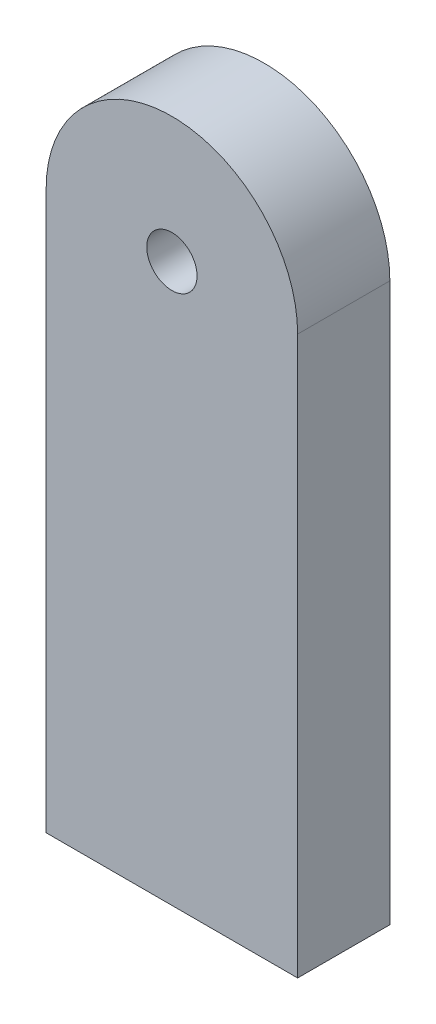
ISO-10303-21;
HEADER;
FILE_DESCRIPTION(('STEP AP214'),'2;1');
FILE_NAME('part.step','',(''),(''),'','','');
FILE_SCHEMA(('AUTOMOTIVE_DESIGN { 1 0 10303 214 1 1 1 1 }'));
ENDSEC;
DATA;
#1=APPLICATION_CONTEXT('core data for automotive mechanical design processes');
#2=APPLICATION_PROTOCOL_DEFINITION('international standard','automotive_design',2000,#1);
#3=PRODUCT_CONTEXT('',#1,'mechanical');
#4=PRODUCT('Part','Part','',(#3));
#5=PRODUCT_RELATED_PRODUCT_CATEGORY('part','',(#4));
#6=PRODUCT_DEFINITION_FORMATION('','',#4);
#7=PRODUCT_DEFINITION_CONTEXT('part definition',#1,'design');
#8=PRODUCT_DEFINITION('design','',#6,#7);
#9=PRODUCT_DEFINITION_SHAPE('','',#8);
#10=(LENGTH_UNIT() NAMED_UNIT(*) SI_UNIT(.MILLI.,.METRE.));
#11=(NAMED_UNIT(*) PLANE_ANGLE_UNIT() SI_UNIT($,.RADIAN.));
#12=(NAMED_UNIT(*) SI_UNIT($,.STERADIAN.) SOLID_ANGLE_UNIT());
#13=UNCERTAINTY_MEASURE_WITH_UNIT(LENGTH_MEASURE(1.E-05),#10,'distance_accuracy_value','');
#14=(GEOMETRIC_REPRESENTATION_CONTEXT(3) GLOBAL_UNCERTAINTY_ASSIGNED_CONTEXT((#13)) GLOBAL_UNIT_ASSIGNED_CONTEXT((#10,
#11,#12)) REPRESENTATION_CONTEXT('',''));
#15=CARTESIAN_POINT('',(0.,0.,0.));
#16=DIRECTION('',(0.,0.,1.));
#17=DIRECTION('',(1.,0.,0.));
#18=AXIS2_PLACEMENT_3D('',#15,#16,#17);
#19=CARTESIAN_POINT('',(-0.0428818166233677,0.0822453345982986,2.5));
#20=DIRECTION('',(0.,0.,-1.));
#21=DIRECTION('',(-1.,0.,0.));
#22=AXIS2_PLACEMENT_3D('',#19,#20,#21);
#23=CYLINDRICAL_SURFACE('',#22,7.5);
#24=CARTESIAN_POINT('',(-0.0428818166233677,0.0822453345982986,0.));
#25=DIRECTION('',(0.,0.,1.));
#26=DIRECTION('',(1.,0.,0.));
#27=AXIS2_PLACEMENT_3D('',#24,#25,#26);
#28=CIRCLE('',#27,7.5);
#29=CARTESIAN_POINT('',(7.45711818337663,0.0822453345983,0.));
#30=VERTEX_POINT('',#29);
#31=CARTESIAN_POINT('',(-7.54288181662337,0.0822453345982986,0.));
#32=VERTEX_POINT('',#31);
#33=EDGE_CURVE('E122',#30,#32,#28,.T.);
#34=ORIENTED_EDGE('',*,*,#33,.T.);
#35=DIRECTION('',(0.,0.,-1.));
#36=VECTOR('',#35,1.);
#37=CARTESIAN_POINT('',(-7.54288181662337,0.0822453345982986,2.5));
#38=LINE('',#37,#36);
#39=CARTESIAN_POINT('',(-7.54288181662337,0.0822453345982986,5.5));
#40=VERTEX_POINT('',#39);
#41=EDGE_CURVE('E11',#40,#32,#38,.T.);
#42=ORIENTED_EDGE('',*,*,#41,.F.);
#43=CARTESIAN_POINT('',(-0.0428818166233677,0.0822453345982986,5.5));
#44=DIRECTION('',(0.,0.,1.));
#45=DIRECTION('',(1.,0.,0.));
#46=AXIS2_PLACEMENT_3D('',#43,#44,#45);
#47=CIRCLE('',#46,7.5);
#48=CARTESIAN_POINT('',(7.45711818337663,0.0822453345983,5.5));
#49=VERTEX_POINT('',#48);
#50=EDGE_CURVE('E188',#49,#40,#47,.T.);
#51=ORIENTED_EDGE('',*,*,#50,.F.);
#52=DIRECTION('',(0.,0.,-1.));
#53=VECTOR('',#52,1.);
#54=CARTESIAN_POINT('',(7.45711818337663,0.0822453345983,2.5));
#55=LINE('',#54,#53);
#56=EDGE_CURVE('E108',#49,#30,#55,.T.);
#57=ORIENTED_EDGE('',*,*,#56,.T.);
#58=EDGE_LOOP('',(#34,#42,#51,#57));
#59=FACE_BOUND('',#58,.T.);
#60=ADVANCED_FACE('F43',(#59),#23,.T.);
#61=CARTESIAN_POINT('',(-7.54288181662337,0.,2.5));
#62=DIRECTION('',(-1.,0.,0.));
#63=DIRECTION('',(0.,0.,1.));
#64=AXIS2_PLACEMENT_3D('',#61,#62,#63);
#65=PLANE('',#64);
#66=DIRECTION('',(0.,1.,0.));
#67=VECTOR('',#66,1.);
#68=CARTESIAN_POINT('',(-7.54288181662337,0.,0.));
#69=LINE('',#68,#67);
#70=CARTESIAN_POINT('',(-7.54288181662337,-33.1765471745876,0.));
#71=VERTEX_POINT('',#70);
#72=EDGE_CURVE('E117',#71,#32,#69,.T.);
#73=ORIENTED_EDGE('',*,*,#72,.F.);
#74=DIRECTION('',(0.,0.,-1.));
#75=VECTOR('',#74,1.);
#76=CARTESIAN_POINT('',(-7.54288181662337,-33.1765471745876,2.5));
#77=LINE('',#76,#75);
#78=CARTESIAN_POINT('',(-7.54288181662337,-33.1765471745876,5.5));
#79=VERTEX_POINT('',#78);
#80=EDGE_CURVE('E53',#79,#71,#77,.T.);
#81=ORIENTED_EDGE('',*,*,#80,.F.);
#82=DIRECTION('',(0.,-1.,0.));
#83=VECTOR('',#82,1.);
#84=CARTESIAN_POINT('',(-7.54288181662337,-33.1765471745876,5.5));
#85=LINE('',#84,#83);
#86=EDGE_CURVE('E183',#40,#79,#85,.T.);
#87=ORIENTED_EDGE('',*,*,#86,.F.);
#88=ORIENTED_EDGE('',*,*,#41,.T.);
#89=EDGE_LOOP('',(#73,#81,#87,#88));
#90=FACE_BOUND('',#89,.T.);
#91=ADVANCED_FACE('F177',(#90),#65,.T.);
#92=CARTESIAN_POINT('',(0.,-33.1765471745876,2.5));
#93=DIRECTION('',(0.,-1.,0.));
#94=DIRECTION('',(0.,0.,-1.));
#95=AXIS2_PLACEMENT_3D('',#92,#93,#94);
#96=PLANE('',#95);
#97=DIRECTION('',(-1.,0.,0.));
#98=VECTOR('',#97,1.);
#99=CARTESIAN_POINT('',(0.,-33.1765471745876,0.));
#100=LINE('',#99,#98);
#101=CARTESIAN_POINT('',(7.45711818337664,-33.1765471745876,0.));
#102=VERTEX_POINT('',#101);
#103=EDGE_CURVE('E111',#102,#71,#100,.T.);
#104=ORIENTED_EDGE('',*,*,#103,.F.);
#105=DIRECTION('',(0.,0.,-1.));
#106=VECTOR('',#105,1.);
#107=CARTESIAN_POINT('',(7.45711818337664,-33.1765471745876,2.5));
#108=LINE('',#107,#106);
#109=CARTESIAN_POINT('',(7.45711818337664,-33.1765471745876,5.5));
#110=VERTEX_POINT('',#109);
#111=EDGE_CURVE('E96',#110,#102,#108,.T.);
#112=ORIENTED_EDGE('',*,*,#111,.F.);
#113=DIRECTION('',(1.,0.,0.));
#114=VECTOR('',#113,1.);
#115=CARTESIAN_POINT('',(7.45711818337664,-33.1765471745876,5.5));
#116=LINE('',#115,#114);
#117=EDGE_CURVE('E194',#79,#110,#116,.T.);
#118=ORIENTED_EDGE('',*,*,#117,.F.);
#119=ORIENTED_EDGE('',*,*,#80,.T.);
#120=EDGE_LOOP('',(#104,#112,#118,#119));
#121=FACE_BOUND('',#120,.T.);
#122=ADVANCED_FACE('F112',(#121),#96,.T.);
#123=CARTESIAN_POINT('',(0.,-2.81893976807957,2.5));
#124=DIRECTION('',(0.,1.,0.));
#125=DIRECTION('',(0.,0.,1.));
#126=AXIS2_PLACEMENT_3D('',#123,#124,#125);
#127=PLANE('',#126);
#128=DIRECTION('',(1.,0.,0.));
#129=VECTOR('',#128,1.);
#130=CARTESIAN_POINT('',(0.,-2.81893976807957,0.));
#131=LINE('',#130,#129);
#132=CARTESIAN_POINT('',(-1.71788181662337,-2.81893976807957,0.));
#133=VERTEX_POINT('',#132);
#134=CARTESIAN_POINT('',(1.63211818337673,-2.81893976807957,0.));
#135=VERTEX_POINT('',#134);
#136=EDGE_CURVE('E157',#133,#135,#131,.T.);
#137=ORIENTED_EDGE('',*,*,#136,.F.);
#138=DIRECTION('',(0.,0.,-1.));
#139=VECTOR('',#138,1.);
#140=CARTESIAN_POINT('',(-1.71788181662337,-2.81893976807957,2.5));
#141=LINE('',#140,#139);
#142=CARTESIAN_POINT('',(-1.71788181662337,-2.81893976807957,2.5));
#143=VERTEX_POINT('',#142);
#144=EDGE_CURVE('E47',#143,#133,#141,.T.);
#145=ORIENTED_EDGE('',*,*,#144,.F.);
#146=DIRECTION('',(1.,0.,0.));
#147=VECTOR('',#146,1.);
#148=CARTESIAN_POINT('',(0.,-2.81893976807957,2.5));
#149=LINE('',#148,#147);
#150=CARTESIAN_POINT('',(1.63211818337673,-2.81893976807957,2.5));
#151=VERTEX_POINT('',#150);
#152=EDGE_CURVE('E123',#143,#151,#149,.T.);
#153=ORIENTED_EDGE('',*,*,#152,.T.);
#154=DIRECTION('',(0.,0.,-1.));
#155=VECTOR('',#154,1.);
#156=CARTESIAN_POINT('',(1.63211818337673,-2.81893976807957,2.5));
#157=LINE('',#156,#155);
#158=EDGE_CURVE('E132',#151,#135,#157,.T.);
#159=ORIENTED_EDGE('',*,*,#158,.T.);
#160=EDGE_LOOP('',(#137,#145,#153,#159));
#161=FACE_BOUND('',#160,.T.);
#162=ADVANCED_FACE('F45',(#161),#127,.T.);
#163=CARTESIAN_POINT('',(-2.50904808791509,-1.44859958896749,2.5));
#164=DIRECTION('',(0.866025403784439,0.5,0.));
#165=DIRECTION('',(-0.5,0.866025403784439,0.));
#166=AXIS2_PLACEMENT_3D('',#163,#164,#165);
#167=PLANE('',#166);
#168=DIRECTION('',(0.5,-0.866025403784439,0.));
#169=VECTOR('',#168,1.);
#170=CARTESIAN_POINT('',(-2.50904808791509,-1.44859958896749,0.));
#171=LINE('',#170,#169);
#172=CARTESIAN_POINT('',(-3.39288181662337,0.0822453345982986,0.));
#173=VERTEX_POINT('',#172);
#174=EDGE_CURVE('E152',#173,#133,#171,.T.);
#175=ORIENTED_EDGE('',*,*,#174,.F.);
#176=DIRECTION('',(0.,0.,-1.));
#177=VECTOR('',#176,1.);
#178=CARTESIAN_POINT('',(-3.39288181662337,0.0822453345982986,2.5));
#179=LINE('',#178,#177);
#180=CARTESIAN_POINT('',(-3.39288181662337,0.0822453345982986,2.5));
#181=VERTEX_POINT('',#180);
#182=EDGE_CURVE('E140',#181,#173,#179,.T.);
#183=ORIENTED_EDGE('',*,*,#182,.F.);
#184=DIRECTION('',(0.5,-0.866025403784439,0.));
#185=VECTOR('',#184,1.);
#186=CARTESIAN_POINT('',(-2.50904808791509,-1.44859958896749,2.5));
#187=LINE('',#186,#185);
#188=EDGE_CURVE('E126',#181,#143,#187,.T.);
#189=ORIENTED_EDGE('',*,*,#188,.T.);
#190=ORIENTED_EDGE('',*,*,#144,.T.);
#191=EDGE_LOOP('',(#175,#183,#189,#190));
#192=FACE_BOUND('',#191,.T.);
#193=ADVANCED_FACE('F150',(#192),#167,.T.);
#194=CARTESIAN_POINT('',(-2.58027463702004,1.48972225626659,2.5));
#195=DIRECTION('',(0.866025403784452,-0.499999999999977,0.));
#196=DIRECTION('',(0.499999999999977,0.866025403784452,0.));
#197=AXIS2_PLACEMENT_3D('',#194,#195,#196);
#198=PLANE('',#197);
#199=DIRECTION('',(-0.499999999999977,-0.866025403784452,0.));
#200=VECTOR('',#199,1.);
#201=CARTESIAN_POINT('',(-2.58027463702004,1.48972225626659,0.));
#202=LINE('',#201,#200);
#203=CARTESIAN_POINT('',(-1.71788181662344,2.98343043727621,0.));
#204=VERTEX_POINT('',#203);
#205=EDGE_CURVE('E164',#204,#173,#202,.T.);
#206=ORIENTED_EDGE('',*,*,#205,.F.);
#207=DIRECTION('',(0.,0.,-1.));
#208=VECTOR('',#207,1.);
#209=CARTESIAN_POINT('',(-1.71788181662344,2.98343043727621,2.5));
#210=LINE('',#209,#208);
#211=CARTESIAN_POINT('',(-1.71788181662344,2.98343043727621,2.5));
#212=VERTEX_POINT('',#211);
#213=EDGE_CURVE('E139',#212,#204,#210,.T.);
#214=ORIENTED_EDGE('',*,*,#213,.F.);
#215=DIRECTION('',(-0.499999999999977,-0.866025403784452,0.));
#216=VECTOR('',#215,1.);
#217=CARTESIAN_POINT('',(-2.58027463702004,1.48972225626659,2.5));
#218=LINE('',#217,#216);
#219=EDGE_CURVE('E200',#212,#181,#218,.T.);
#220=ORIENTED_EDGE('',*,*,#219,.T.);
#221=ORIENTED_EDGE('',*,*,#182,.T.);
#222=EDGE_LOOP('',(#206,#214,#220,#221));
#223=FACE_BOUND('',#222,.T.);
#224=ADVANCED_FACE('F221',(#223),#198,.T.);
#225=CARTESIAN_POINT('',(0.,2.98343043727621,2.5));
#226=DIRECTION('',(0.,-1.,0.));
#227=DIRECTION('',(1.,0.,0.));
#228=AXIS2_PLACEMENT_3D('',#225,#226,#227);
#229=PLANE('',#228);
#230=DIRECTION('',(-1.,0.,0.));
#231=VECTOR('',#230,1.);
#232=CARTESIAN_POINT('',(0.,2.98343043727621,0.));
#233=LINE('',#232,#231);
#234=CARTESIAN_POINT('',(1.63211818337661,2.98343043727621,0.));
#235=VERTEX_POINT('',#234);
#236=EDGE_CURVE('E166',#235,#204,#233,.T.);
#237=ORIENTED_EDGE('',*,*,#236,.F.);
#238=DIRECTION('',(0.,0.,-1.));
#239=VECTOR('',#238,1.);
#240=CARTESIAN_POINT('',(1.63211818337661,2.98343043727621,2.5));
#241=LINE('',#240,#239);
#242=CARTESIAN_POINT('',(1.63211818337661,2.98343043727621,2.5));
#243=VERTEX_POINT('',#242);
#244=EDGE_CURVE('E137',#243,#235,#241,.T.);
#245=ORIENTED_EDGE('',*,*,#244,.F.);
#246=DIRECTION('',(-1.,0.,0.));
#247=VECTOR('',#246,1.);
#248=CARTESIAN_POINT('',(0.,2.98343043727621,2.5));
#249=LINE('',#248,#247);
#250=EDGE_CURVE('E202',#243,#212,#249,.T.);
#251=ORIENTED_EDGE('',*,*,#250,.T.);
#252=ORIENTED_EDGE('',*,*,#213,.T.);
#253=EDGE_LOOP('',(#237,#245,#251,#252));
#254=FACE_BOUND('',#253,.T.);
#255=ADVANCED_FACE('F225',(#254),#229,.T.);
#256=CARTESIAN_POINT('',(2.51595191208491,1.45258551371038,2.5));
#257=DIRECTION('',(-0.866025403784439,-0.5,0.));
#258=DIRECTION('',(0.5,-0.866025403784439,0.));
#259=AXIS2_PLACEMENT_3D('',#256,#257,#258);
#260=PLANE('',#259);
#261=DIRECTION('',(-0.5,0.866025403784439,0.));
#262=VECTOR('',#261,1.);
#263=CARTESIAN_POINT('',(2.51595191208491,1.45258551371038,0.));
#264=LINE('',#263,#262);
#265=CARTESIAN_POINT('',(3.30711818337663,0.0822453345982995,0.));
#266=VERTEX_POINT('',#265);
#267=EDGE_CURVE('E171',#266,#235,#264,.T.);
#268=ORIENTED_EDGE('',*,*,#267,.F.);
#269=DIRECTION('',(0.,0.,-1.));
#270=VECTOR('',#269,1.);
#271=CARTESIAN_POINT('',(3.30711818337663,0.0822453345982995,2.5));
#272=LINE('',#271,#270);
#273=CARTESIAN_POINT('',(3.30711818337663,0.0822453345982995,2.5));
#274=VERTEX_POINT('',#273);
#275=EDGE_CURVE('E134',#274,#266,#272,.T.);
#276=ORIENTED_EDGE('',*,*,#275,.F.);
#277=DIRECTION('',(-0.5,0.866025403784439,0.));
#278=VECTOR('',#277,1.);
#279=CARTESIAN_POINT('',(2.51595191208491,1.45258551371038,2.5));
#280=LINE('',#279,#278);
#281=EDGE_CURVE('E61',#274,#243,#280,.T.);
#282=ORIENTED_EDGE('',*,*,#281,.T.);
#283=ORIENTED_EDGE('',*,*,#244,.T.);
#284=EDGE_LOOP('',(#268,#276,#282,#283));
#285=FACE_BOUND('',#284,.T.);
#286=ADVANCED_FACE('F227',(#285),#260,.T.);
#287=CARTESIAN_POINT('',(2.44472536298011,-1.41146284641119,2.5));
#288=DIRECTION('',(-0.866025403784452,0.499999999999978,0.));
#289=DIRECTION('',(-0.499999999999978,-0.866025403784452,0.));
#290=AXIS2_PLACEMENT_3D('',#287,#288,#289);
#291=PLANE('',#290);
#292=DIRECTION('',(0.499999999999978,0.866025403784452,0.));
#293=VECTOR('',#292,1.);
#294=CARTESIAN_POINT('',(2.44472536298011,-1.41146284641119,0.));
#295=LINE('',#294,#293);
#296=EDGE_CURVE('E174',#135,#266,#295,.T.);
#297=ORIENTED_EDGE('',*,*,#296,.F.);
#298=ORIENTED_EDGE('',*,*,#158,.F.);
#299=DIRECTION('',(0.499999999999978,0.866025403784452,0.));
#300=VECTOR('',#299,1.);
#301=CARTESIAN_POINT('',(2.44472536298011,-1.41146284641119,2.5));
#302=LINE('',#301,#300);
#303=EDGE_CURVE('E135',#151,#274,#302,.T.);
#304=ORIENTED_EDGE('',*,*,#303,.T.);
#305=ORIENTED_EDGE('',*,*,#275,.T.);
#306=EDGE_LOOP('',(#297,#298,#304,#305));
#307=FACE_BOUND('',#306,.T.);
#308=ADVANCED_FACE('F207',(#307),#291,.T.);
#309=CARTESIAN_POINT('',(7.45711818337663,0.,2.5));
#310=DIRECTION('',(1.,0.,0.));
#311=DIRECTION('',(0.,1.,0.));
#312=AXIS2_PLACEMENT_3D('',#309,#310,#311);
#313=PLANE('',#312);
#314=DIRECTION('',(0.,-1.,0.));
#315=VECTOR('',#314,1.);
#316=CARTESIAN_POINT('',(7.45711818337663,0.,0.));
#317=LINE('',#316,#315);
#318=EDGE_CURVE('E101',#30,#102,#317,.T.);
#319=ORIENTED_EDGE('',*,*,#318,.F.);
#320=ORIENTED_EDGE('',*,*,#56,.F.);
#321=DIRECTION('',(0.,1.,0.));
#322=VECTOR('',#321,1.);
#323=CARTESIAN_POINT('',(7.45711818337663,0.0822453345983,5.5));
#324=LINE('',#323,#322);
#325=EDGE_CURVE('E104',#110,#49,#324,.T.);
#326=ORIENTED_EDGE('',*,*,#325,.F.);
#327=ORIENTED_EDGE('',*,*,#111,.T.);
#328=EDGE_LOOP('',(#319,#320,#326,#327));
#329=FACE_BOUND('',#328,.T.);
#330=ADVANCED_FACE('F98',(#329),#313,.T.);
#331=CARTESIAN_POINT('',(0.,0.,0.));
#332=DIRECTION('',(0.,0.,1.));
#333=DIRECTION('',(1.,0.,0.));
#334=AXIS2_PLACEMENT_3D('',#331,#332,#333);
#335=PLANE('',#334);
#336=ORIENTED_EDGE('',*,*,#136,.T.);
#337=ORIENTED_EDGE('',*,*,#296,.T.);
#338=ORIENTED_EDGE('',*,*,#267,.T.);
#339=ORIENTED_EDGE('',*,*,#236,.T.);
#340=ORIENTED_EDGE('',*,*,#205,.T.);
#341=ORIENTED_EDGE('',*,*,#174,.T.);
#342=EDGE_LOOP('',(#336,#337,#338,#339,#340,#341));
#343=FACE_BOUND('',#342,.T.);
#344=ORIENTED_EDGE('',*,*,#33,.F.);
#345=ORIENTED_EDGE('',*,*,#318,.T.);
#346=ORIENTED_EDGE('',*,*,#103,.T.);
#347=ORIENTED_EDGE('',*,*,#72,.T.);
#348=EDGE_LOOP('',(#344,#345,#346,#347));
#349=FACE_BOUND('',#348,.T.);
#350=ADVANCED_FACE('F120',(#343,#349),#335,.F.);
#351=CARTESIAN_POINT('',(-0.0428818166233677,0.0822453345982986,5.5));
#352=DIRECTION('',(0.,0.,1.));
#353=DIRECTION('',(1.,0.,0.));
#354=AXIS2_PLACEMENT_3D('',#351,#352,#353);
#355=PLANE('',#354);
#356=ORIENTED_EDGE('',*,*,#50,.T.);
#357=ORIENTED_EDGE('',*,*,#86,.T.);
#358=ORIENTED_EDGE('',*,*,#117,.T.);
#359=ORIENTED_EDGE('',*,*,#325,.T.);
#360=EDGE_LOOP('',(#356,#357,#358,#359));
#361=FACE_BOUND('',#360,.T.);
#362=CARTESIAN_POINT('',(-0.0428818166233677,0.0822453345982986,5.5));
#363=DIRECTION('',(0.,0.,1.));
#364=DIRECTION('',(1.,0.,0.));
#365=AXIS2_PLACEMENT_3D('',#362,#363,#364);
#366=CIRCLE('',#365,1.5);
#367=CARTESIAN_POINT('',(1.45711818337663,0.0822453345982986,5.5));
#368=VERTEX_POINT('',#367);
#369=EDGE_CURVE('E261',#368,#368,#366,.T.);
#370=ORIENTED_EDGE('',*,*,#369,.F.);
#371=EDGE_LOOP('',(#370));
#372=FACE_BOUND('',#371,.T.);
#373=ADVANCED_FACE('F192',(#361,#372),#355,.T.);
#374=CARTESIAN_POINT('',(-0.0428818166233677,0.0822453345982986,2.5));
#375=DIRECTION('',(0.,0.,1.));
#376=DIRECTION('',(1.,0.,0.));
#377=AXIS2_PLACEMENT_3D('',#374,#375,#376);
#378=PLANE('',#377);
#379=ORIENTED_EDGE('',*,*,#152,.F.);
#380=ORIENTED_EDGE('',*,*,#188,.F.);
#381=ORIENTED_EDGE('',*,*,#219,.F.);
#382=ORIENTED_EDGE('',*,*,#250,.F.);
#383=ORIENTED_EDGE('',*,*,#281,.F.);
#384=ORIENTED_EDGE('',*,*,#303,.F.);
#385=EDGE_LOOP('',(#379,#380,#381,#382,#383,#384));
#386=FACE_BOUND('',#385,.T.);
#387=CARTESIAN_POINT('',(-0.0428818166233677,0.0822453345982986,2.5));
#388=DIRECTION('',(0.,0.,1.));
#389=DIRECTION('',(1.,0.,0.));
#390=AXIS2_PLACEMENT_3D('',#387,#388,#389);
#391=CIRCLE('',#390,1.5);
#392=CARTESIAN_POINT('',(1.45711818337663,0.0822453345982986,2.5));
#393=VERTEX_POINT('',#392);
#394=EDGE_CURVE('E264',#393,#393,#391,.T.);
#395=ORIENTED_EDGE('',*,*,#394,.T.);
#396=EDGE_LOOP('',(#395));
#397=FACE_BOUND('',#396,.T.);
#398=ADVANCED_FACE('F210',(#386,#397),#378,.F.);
#399=CARTESIAN_POINT('',(-0.0428818166233677,0.0822453345982986,5.5));
#400=DIRECTION('',(0.,0.,-1.));
#401=DIRECTION('',(-1.,0.,0.));
#402=AXIS2_PLACEMENT_3D('',#399,#400,#401);
#403=CYLINDRICAL_SURFACE('',#402,1.5);
#404=ORIENTED_EDGE('',*,*,#369,.T.);
#405=EDGE_LOOP('',(#404));
#406=FACE_BOUND('',#405,.T.);
#407=ORIENTED_EDGE('',*,*,#394,.F.);
#408=EDGE_LOOP('',(#407));
#409=FACE_BOUND('',#408,.T.);
#410=ADVANCED_FACE('F251',(#406,#409),#403,.F.);
#411=CLOSED_SHELL('',(#60,#91,#122,#162,#193,#224,#255,#286,#308,#330,#350,#373,#398,#410));
#412=MANIFOLD_SOLID_BREP('B2',#411);
#413=ADVANCED_BREP_SHAPE_REPRESENTATION('',(#18,#412),#14);
#414=SHAPE_DEFINITION_REPRESENTATION(#9,#413);
ENDSEC;
END-ISO-10303-21;
